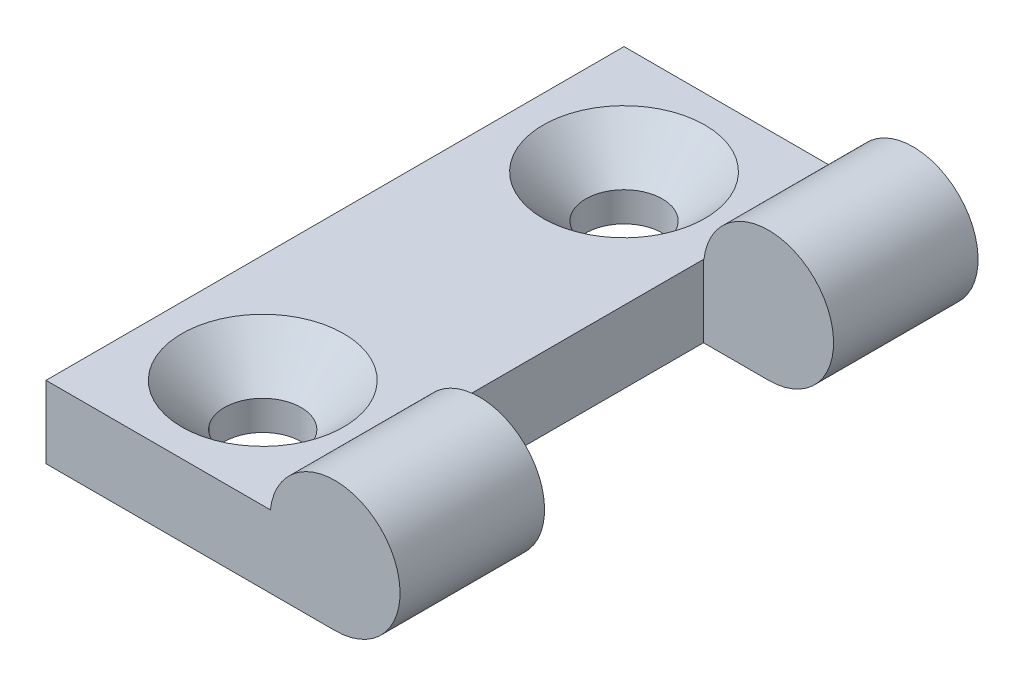
ISO-10303-21;
HEADER;
FILE_DESCRIPTION(('STEP AP214'),'2;1');
FILE_NAME('part.step','',(''),(''),'','','');
FILE_SCHEMA(('AUTOMOTIVE_DESIGN { 1 0 10303 214 1 1 1 1 }'));
ENDSEC;
DATA;
#1=APPLICATION_CONTEXT('core data for automotive mechanical design processes');
#2=APPLICATION_PROTOCOL_DEFINITION('international standard','automotive_design',2000,#1);
#3=PRODUCT_CONTEXT('',#1,'mechanical');
#4=PRODUCT('Part','Part','',(#3));
#5=PRODUCT_RELATED_PRODUCT_CATEGORY('part','',(#4));
#6=PRODUCT_DEFINITION_FORMATION('','',#4);
#7=PRODUCT_DEFINITION_CONTEXT('part definition',#1,'design');
#8=PRODUCT_DEFINITION('design','',#6,#7);
#9=PRODUCT_DEFINITION_SHAPE('','',#8);
#10=(LENGTH_UNIT() NAMED_UNIT(*) SI_UNIT(.MILLI.,.METRE.));
#11=(NAMED_UNIT(*) PLANE_ANGLE_UNIT() SI_UNIT($,.RADIAN.));
#12=(NAMED_UNIT(*) SI_UNIT($,.STERADIAN.) SOLID_ANGLE_UNIT());
#13=UNCERTAINTY_MEASURE_WITH_UNIT(LENGTH_MEASURE(1.E-05),#10,'distance_accuracy_value','');
#14=(GEOMETRIC_REPRESENTATION_CONTEXT(3) GLOBAL_UNCERTAINTY_ASSIGNED_CONTEXT((#13)) GLOBAL_UNIT_ASSIGNED_CONTEXT((#10,
#11,#12)) REPRESENTATION_CONTEXT('',''));
#15=CARTESIAN_POINT('',(0.,0.,0.));
#16=DIRECTION('',(0.,0.,1.));
#17=DIRECTION('',(1.,0.,0.));
#18=AXIS2_PLACEMENT_3D('',#15,#16,#17);
#19=CARTESIAN_POINT('',(-2.5,4.99999999993861,12.5));
#20=DIRECTION('',(0.,1.,0.));
#21=DIRECTION('',(0.,0.,1.));
#22=AXIS2_PLACEMENT_3D('',#19,#20,#21);
#23=CONICAL_SURFACE('',#22,5.59999999989031,0.785398163397448);
#24=CARTESIAN_POINT('',(-2.5,2.04999999999999,12.5));
#25=DIRECTION('',(0.,1.,0.));
#26=DIRECTION('',(0.,0.,1.));
#27=AXIS2_PLACEMENT_3D('',#24,#25,#26);
#28=CIRCLE('',#27,2.64999999999999);
#29=CARTESIAN_POINT('',(-2.5,2.04999999999999,15.15));
#30=VERTEX_POINT('',#29);
#31=EDGE_CURVE('E132',#30,#30,#28,.F.);
#32=ORIENTED_EDGE('',*,*,#31,.T.);
#33=EDGE_LOOP('',(#32));
#34=FACE_BOUND('',#33,.T.);
#35=CARTESIAN_POINT('',(-2.5,4.99999999999545,12.5));
#36=DIRECTION('',(0.,1.,0.));
#37=DIRECTION('',(0.,0.,1.));
#38=AXIS2_PLACEMENT_3D('',#35,#36,#37);
#39=CIRCLE('',#38,5.59999999994716);
#40=CARTESIAN_POINT('',(-2.5,4.99999999999545,18.0999999999472));
#41=VERTEX_POINT('',#40);
#42=EDGE_CURVE('E20',#41,#41,#39,.F.);
#43=ORIENTED_EDGE('',*,*,#42,.F.);
#44=EDGE_LOOP('',(#43));
#45=FACE_BOUND('',#44,.T.);
#46=ADVANCED_FACE('F17',(#34,#45),#23,.F.);
#47=CARTESIAN_POINT('',(-2.5,4.99999999988177,-12.5));
#48=DIRECTION('',(0.,1.,0.));
#49=DIRECTION('',(0.,0.,1.));
#50=AXIS2_PLACEMENT_3D('',#47,#48,#49);
#51=CONICAL_SURFACE('',#50,5.5999999999699,0.785398163407083);
#52=CARTESIAN_POINT('',(-2.5,2.04999999999999,-12.5));
#53=DIRECTION('',(0.,1.,0.));
#54=DIRECTION('',(0.,0.,1.));
#55=AXIS2_PLACEMENT_3D('',#52,#53,#54);
#56=CIRCLE('',#55,2.64999999999999);
#57=CARTESIAN_POINT('',(-2.5,2.04999999999999,-9.85000000000001));
#58=VERTEX_POINT('',#57);
#59=EDGE_CURVE('E120',#58,#58,#56,.F.);
#60=ORIENTED_EDGE('',*,*,#59,.T.);
#61=EDGE_LOOP('',(#60));
#62=FACE_BOUND('',#61,.T.);
#63=CARTESIAN_POINT('',(-2.5,4.99999999992724,-12.5));
#64=DIRECTION('',(0.,1.,0.));
#65=DIRECTION('',(0.,0.,1.));
#66=AXIS2_PLACEMENT_3D('',#63,#64,#65);
#67=CIRCLE('',#66,5.60000000001537);
#68=CARTESIAN_POINT('',(-2.5,4.99999999992724,-6.89999999998463));
#69=VERTEX_POINT('',#68);
#70=EDGE_CURVE('E137',#69,#69,#67,.F.);
#71=ORIENTED_EDGE('',*,*,#70,.F.);
#72=EDGE_LOOP('',(#71));
#73=FACE_BOUND('',#72,.T.);
#74=ADVANCED_FACE('F170',(#62,#73),#51,.F.);
#75=CARTESIAN_POINT('',(0.,5.,0.));
#76=DIRECTION('',(0.,1.,0.));
#77=DIRECTION('',(0.,0.,1.));
#78=AXIS2_PLACEMENT_3D('',#75,#76,#77);
#79=PLANE('',#78);
#80=DIRECTION('',(1.,0.,0.));
#81=VECTOR('',#80,1.);
#82=CARTESIAN_POINT('',(5.50000000000001,5.,10.));
#83=LINE('',#82,#81);
#84=CARTESIAN_POINT('',(5.52786404500043,5.,10.));
#85=VERTEX_POINT('',#84);
#86=CARTESIAN_POINT('',(5.50000000000001,5.,10.));
#87=VERTEX_POINT('',#86);
#88=EDGE_CURVE('E160',#85,#87,#83,.F.);
#89=ORIENTED_EDGE('',*,*,#88,.T.);
#90=DIRECTION('',(0.,0.,1.));
#91=VECTOR('',#90,1.);
#92=CARTESIAN_POINT('',(5.50000000000001,5.,-10.));
#93=LINE('',#92,#91);
#94=CARTESIAN_POINT('',(5.50000000000001,5.,-10.));
#95=VERTEX_POINT('',#94);
#96=EDGE_CURVE('E123',#87,#95,#93,.F.);
#97=ORIENTED_EDGE('',*,*,#96,.T.);
#98=DIRECTION('',(1.,0.,0.));
#99=VECTOR('',#98,1.);
#100=CARTESIAN_POINT('',(0.,5.,-10.));
#101=LINE('',#100,#99);
#102=CARTESIAN_POINT('',(5.52786404500043,5.,-10.));
#103=VERTEX_POINT('',#102);
#104=EDGE_CURVE('E134',#95,#103,#101,.T.);
#105=ORIENTED_EDGE('',*,*,#104,.T.);
#106=DIRECTION('',(0.,0.,1.));
#107=VECTOR('',#106,1.);
#108=CARTESIAN_POINT('',(5.52786404500043,5.,-20.));
#109=LINE('',#108,#107);
#110=CARTESIAN_POINT('',(5.52786404500043,5.,-20.));
#111=VERTEX_POINT('',#110);
#112=EDGE_CURVE('E130',#111,#103,#109,.T.);
#113=ORIENTED_EDGE('',*,*,#112,.F.);
#114=DIRECTION('',(1.,0.,0.));
#115=VECTOR('',#114,1.);
#116=CARTESIAN_POINT('',(-10.,5.,-20.));
#117=LINE('',#116,#115);
#118=CARTESIAN_POINT('',(-10.,5.,-20.));
#119=VERTEX_POINT('',#118);
#120=EDGE_CURVE('E114',#111,#119,#117,.F.);
#121=ORIENTED_EDGE('',*,*,#120,.T.);
#122=DIRECTION('',(0.,0.,-1.));
#123=VECTOR('',#122,1.);
#124=CARTESIAN_POINT('',(-10.,5.,-20.));
#125=LINE('',#124,#123);
#126=CARTESIAN_POINT('',(-9.99999999999999,5.,20.));
#127=VERTEX_POINT('',#126);
#128=EDGE_CURVE('E74',#119,#127,#125,.F.);
#129=ORIENTED_EDGE('',*,*,#128,.T.);
#130=DIRECTION('',(-1.,0.,0.));
#131=VECTOR('',#130,1.);
#132=CARTESIAN_POINT('',(-9.99999999999999,5.,20.));
#133=LINE('',#132,#131);
#134=CARTESIAN_POINT('',(5.52786404500043,5.,20.));
#135=VERTEX_POINT('',#134);
#136=EDGE_CURVE('E90',#127,#135,#133,.F.);
#137=ORIENTED_EDGE('',*,*,#136,.T.);
#138=DIRECTION('',(0.,0.,1.));
#139=VECTOR('',#138,1.);
#140=CARTESIAN_POINT('',(5.52786404500043,5.,0.));
#141=LINE('',#140,#139);
#142=EDGE_CURVE('E133',#135,#85,#141,.F.);
#143=ORIENTED_EDGE('',*,*,#142,.T.);
#144=EDGE_LOOP('',(#89,#97,#105,#113,#121,#129,#137,#143));
#145=FACE_BOUND('',#144,.T.);
#146=ORIENTED_EDGE('',*,*,#70,.T.);
#147=EDGE_LOOP('',(#146));
#148=FACE_BOUND('',#147,.T.);
#149=ORIENTED_EDGE('',*,*,#42,.T.);
#150=EDGE_LOOP('',(#149));
#151=FACE_BOUND('',#150,.T.);
#152=ADVANCED_FACE('F167',(#145,#148,#151),#79,.T.);
#153=CARTESIAN_POINT('',(-2.5,5.,12.5));
#154=DIRECTION('',(0.,1.,0.));
#155=DIRECTION('',(0.,0.,1.));
#156=AXIS2_PLACEMENT_3D('',#153,#154,#155);
#157=CYLINDRICAL_SURFACE('',#156,2.64999999999999);
#158=CARTESIAN_POINT('',(-2.5,0.,12.5));
#159=DIRECTION('',(0.,1.,0.));
#160=DIRECTION('',(0.,0.,1.));
#161=AXIS2_PLACEMENT_3D('',#158,#159,#160);
#162=CIRCLE('',#161,2.64999999999999);
#163=CARTESIAN_POINT('',(-2.5,0.,15.15));
#164=VERTEX_POINT('',#163);
#165=EDGE_CURVE('E150',#164,#164,#162,.F.);
#166=ORIENTED_EDGE('',*,*,#165,.T.);
#167=EDGE_LOOP('',(#166));
#168=FACE_BOUND('',#167,.T.);
#169=ORIENTED_EDGE('',*,*,#31,.F.);
#170=EDGE_LOOP('',(#169));
#171=FACE_BOUND('',#170,.T.);
#172=ADVANCED_FACE('F212',(#168,#171),#157,.F.);
#173=CARTESIAN_POINT('',(-2.5,5.,-12.5));
#174=DIRECTION('',(0.,1.,0.));
#175=DIRECTION('',(0.,0.,1.));
#176=AXIS2_PLACEMENT_3D('',#173,#174,#175);
#177=CYLINDRICAL_SURFACE('',#176,2.64999999999999);
#178=CARTESIAN_POINT('',(-2.5,0.,-12.5));
#179=DIRECTION('',(0.,1.,0.));
#180=DIRECTION('',(0.,0.,1.));
#181=AXIS2_PLACEMENT_3D('',#178,#179,#180);
#182=CIRCLE('',#181,2.64999999999999);
#183=CARTESIAN_POINT('',(-2.5,0.,-9.85000000000001));
#184=VERTEX_POINT('',#183);
#185=EDGE_CURVE('E106',#184,#184,#182,.F.);
#186=ORIENTED_EDGE('',*,*,#185,.T.);
#187=EDGE_LOOP('',(#186));
#188=FACE_BOUND('',#187,.T.);
#189=ORIENTED_EDGE('',*,*,#59,.F.);
#190=EDGE_LOOP('',(#189));
#191=FACE_BOUND('',#190,.T.);
#192=ADVANCED_FACE('F208',(#188,#191),#177,.F.);
#193=CARTESIAN_POINT('',(-10.,5.,-20.));
#194=DIRECTION('',(0.,0.,1.));
#195=DIRECTION('',(1.,0.,0.));
#196=AXIS2_PLACEMENT_3D('',#193,#194,#195);
#197=PLANE('',#196);
#198=DIRECTION('',(1.,0.,0.));
#199=VECTOR('',#198,1.);
#200=CARTESIAN_POINT('',(0.,0.,-20.));
#201=LINE('',#200,#199);
#202=CARTESIAN_POINT('',(10.,0.,-20.));
#203=VERTEX_POINT('',#202);
#204=CARTESIAN_POINT('',(-10.,0.,-20.));
#205=VERTEX_POINT('',#204);
#206=EDGE_CURVE('E104',#203,#205,#201,.F.);
#207=ORIENTED_EDGE('',*,*,#206,.T.);
#208=DIRECTION('',(0.,1.,0.));
#209=VECTOR('',#208,1.);
#210=CARTESIAN_POINT('',(-10.,5.,-20.));
#211=LINE('',#210,#209);
#212=EDGE_CURVE('E82',#205,#119,#211,.T.);
#213=ORIENTED_EDGE('',*,*,#212,.T.);
#214=ORIENTED_EDGE('',*,*,#120,.F.);
#215=CARTESIAN_POINT('',(10.,4.5,-20.));
#216=DIRECTION('',(0.,0.,1.));
#217=DIRECTION('',(1.,0.,0.));
#218=AXIS2_PLACEMENT_3D('',#215,#216,#217);
#219=CIRCLE('',#218,4.5);
#220=EDGE_CURVE('E154',#203,#111,#219,.T.);
#221=ORIENTED_EDGE('',*,*,#220,.F.);
#222=EDGE_LOOP('',(#207,#213,#214,#221));
#223=FACE_BOUND('',#222,.T.);
#224=ADVANCED_FACE('F205',(#223),#197,.F.);
#225=CARTESIAN_POINT('',(-10.,5.,-20.));
#226=DIRECTION('',(1.,0.,0.));
#227=DIRECTION('',(0.,0.,-1.));
#228=AXIS2_PLACEMENT_3D('',#225,#226,#227);
#229=PLANE('',#228);
#230=DIRECTION('',(0.,1.,0.));
#231=VECTOR('',#230,1.);
#232=CARTESIAN_POINT('',(-9.99999999999999,5.,20.));
#233=LINE('',#232,#231);
#234=CARTESIAN_POINT('',(-10.,0.,20.));
#235=VERTEX_POINT('',#234);
#236=EDGE_CURVE('E86',#235,#127,#233,.T.);
#237=ORIENTED_EDGE('',*,*,#236,.T.);
#238=ORIENTED_EDGE('',*,*,#128,.F.);
#239=ORIENTED_EDGE('',*,*,#212,.F.);
#240=DIRECTION('',(0.,0.,1.));
#241=VECTOR('',#240,1.);
#242=CARTESIAN_POINT('',(-10.,0.,0.));
#243=LINE('',#242,#241);
#244=EDGE_CURVE('E97',#205,#235,#243,.T.);
#245=ORIENTED_EDGE('',*,*,#244,.T.);
#246=EDGE_LOOP('',(#237,#238,#239,#245));
#247=FACE_BOUND('',#246,.T.);
#248=ADVANCED_FACE('F103',(#247),#229,.F.);
#249=CARTESIAN_POINT('',(-9.99999999999999,5.,20.));
#250=DIRECTION('',(0.,0.,-1.));
#251=DIRECTION('',(-1.,0.,0.));
#252=AXIS2_PLACEMENT_3D('',#249,#250,#251);
#253=PLANE('',#252);
#254=CARTESIAN_POINT('',(10.,4.5,20.));
#255=DIRECTION('',(0.,0.,1.));
#256=DIRECTION('',(1.,0.,0.));
#257=AXIS2_PLACEMENT_3D('',#254,#255,#256);
#258=CIRCLE('',#257,4.5);
#259=CARTESIAN_POINT('',(10.,0.,20.));
#260=VERTEX_POINT('',#259);
#261=EDGE_CURVE('E65',#135,#260,#258,.F.);
#262=ORIENTED_EDGE('',*,*,#261,.F.);
#263=ORIENTED_EDGE('',*,*,#136,.F.);
#264=ORIENTED_EDGE('',*,*,#236,.F.);
#265=DIRECTION('',(1.,0.,0.));
#266=VECTOR('',#265,1.);
#267=CARTESIAN_POINT('',(0.,0.,20.));
#268=LINE('',#267,#266);
#269=EDGE_CURVE('E89',#235,#260,#268,.T.);
#270=ORIENTED_EDGE('',*,*,#269,.T.);
#271=EDGE_LOOP('',(#262,#263,#264,#270));
#272=FACE_BOUND('',#271,.T.);
#273=ADVANCED_FACE('F88',(#272),#253,.F.);
#274=CARTESIAN_POINT('',(10.,4.5,-20.));
#275=DIRECTION('',(0.,0.,1.));
#276=DIRECTION('',(1.,0.,0.));
#277=AXIS2_PLACEMENT_3D('',#274,#275,#276);
#278=CYLINDRICAL_SURFACE('',#277,4.5);
#279=ORIENTED_EDGE('',*,*,#261,.T.);
#280=DIRECTION('',(0.,0.,1.));
#281=VECTOR('',#280,1.);
#282=CARTESIAN_POINT('',(10.,0.,0.));
#283=LINE('',#282,#281);
#284=CARTESIAN_POINT('',(10.,0.,10.));
#285=VERTEX_POINT('',#284);
#286=EDGE_CURVE('E101',#260,#285,#283,.F.);
#287=ORIENTED_EDGE('',*,*,#286,.T.);
#288=CARTESIAN_POINT('',(10.,4.5,10.));
#289=DIRECTION('',(0.,0.,1.));
#290=DIRECTION('',(1.,0.,0.));
#291=AXIS2_PLACEMENT_3D('',#288,#289,#290);
#292=CIRCLE('',#291,4.5);
#293=EDGE_CURVE('E157',#285,#85,#292,.T.);
#294=ORIENTED_EDGE('',*,*,#293,.T.);
#295=ORIENTED_EDGE('',*,*,#142,.F.);
#296=EDGE_LOOP('',(#279,#287,#294,#295));
#297=FACE_BOUND('',#296,.T.);
#298=ADVANCED_FACE('F196',(#297),#278,.T.);
#299=CARTESIAN_POINT('',(5.50000000000001,9.,10.));
#300=DIRECTION('',(0.,0.,1.));
#301=DIRECTION('',(1.,0.,0.));
#302=AXIS2_PLACEMENT_3D('',#299,#300,#301);
#303=PLANE('',#302);
#304=ORIENTED_EDGE('',*,*,#293,.F.);
#305=DIRECTION('',(1.,0.,0.));
#306=VECTOR('',#305,1.);
#307=CARTESIAN_POINT('',(0.,0.,10.));
#308=LINE('',#307,#306);
#309=CARTESIAN_POINT('',(5.50000000000001,0.,10.));
#310=VERTEX_POINT('',#309);
#311=EDGE_CURVE('E230',#285,#310,#308,.F.);
#312=ORIENTED_EDGE('',*,*,#311,.T.);
#313=DIRECTION('',(0.,1.,0.));
#314=VECTOR('',#313,1.);
#315=CARTESIAN_POINT('',(5.50000000000001,9.,10.));
#316=LINE('',#315,#314);
#317=EDGE_CURVE('E127',#310,#87,#316,.T.);
#318=ORIENTED_EDGE('',*,*,#317,.T.);
#319=ORIENTED_EDGE('',*,*,#88,.F.);
#320=EDGE_LOOP('',(#304,#312,#318,#319));
#321=FACE_BOUND('',#320,.T.);
#322=ADVANCED_FACE('F192',(#321),#303,.F.);
#323=CARTESIAN_POINT('',(5.50000000000001,9.,-10.));
#324=DIRECTION('',(-1.,0.,0.));
#325=DIRECTION('',(0.,0.,1.));
#326=AXIS2_PLACEMENT_3D('',#323,#324,#325);
#327=PLANE('',#326);
#328=ORIENTED_EDGE('',*,*,#317,.F.);
#329=DIRECTION('',(0.,0.,1.));
#330=VECTOR('',#329,1.);
#331=CARTESIAN_POINT('',(5.50000000000001,0.,0.));
#332=LINE('',#331,#330);
#333=CARTESIAN_POINT('',(5.50000000000001,0.,-10.));
#334=VERTEX_POINT('',#333);
#335=EDGE_CURVE('E239',#310,#334,#332,.F.);
#336=ORIENTED_EDGE('',*,*,#335,.T.);
#337=DIRECTION('',(0.,1.,0.));
#338=VECTOR('',#337,1.);
#339=CARTESIAN_POINT('',(5.50000000000001,9.,-10.));
#340=LINE('',#339,#338);
#341=EDGE_CURVE('E126',#334,#95,#340,.T.);
#342=ORIENTED_EDGE('',*,*,#341,.T.);
#343=ORIENTED_EDGE('',*,*,#96,.F.);
#344=EDGE_LOOP('',(#328,#336,#342,#343));
#345=FACE_BOUND('',#344,.T.);
#346=ADVANCED_FACE('F188',(#345),#327,.F.);
#347=CARTESIAN_POINT('',(5.50000000000001,9.,-10.));
#348=DIRECTION('',(0.,0.,-1.));
#349=DIRECTION('',(-1.,0.,0.));
#350=AXIS2_PLACEMENT_3D('',#347,#348,#349);
#351=PLANE('',#350);
#352=ORIENTED_EDGE('',*,*,#341,.F.);
#353=DIRECTION('',(1.,0.,0.));
#354=VECTOR('',#353,1.);
#355=CARTESIAN_POINT('',(0.,0.,-10.));
#356=LINE('',#355,#354);
#357=CARTESIAN_POINT('',(10.,0.,-10.));
#358=VERTEX_POINT('',#357);
#359=EDGE_CURVE('E26',#334,#358,#356,.T.);
#360=ORIENTED_EDGE('',*,*,#359,.T.);
#361=CARTESIAN_POINT('',(10.,4.5,-10.));
#362=DIRECTION('',(0.,0.,1.));
#363=DIRECTION('',(1.,0.,0.));
#364=AXIS2_PLACEMENT_3D('',#361,#362,#363);
#365=CIRCLE('',#364,4.5);
#366=EDGE_CURVE('E34',#103,#358,#365,.F.);
#367=ORIENTED_EDGE('',*,*,#366,.F.);
#368=ORIENTED_EDGE('',*,*,#104,.F.);
#369=EDGE_LOOP('',(#352,#360,#367,#368));
#370=FACE_BOUND('',#369,.T.);
#371=ADVANCED_FACE('F183',(#370),#351,.F.);
#372=CARTESIAN_POINT('',(10.,4.5,-20.));
#373=DIRECTION('',(0.,0.,1.));
#374=DIRECTION('',(1.,0.,0.));
#375=AXIS2_PLACEMENT_3D('',#372,#373,#374);
#376=CYLINDRICAL_SURFACE('',#375,4.5);
#377=ORIENTED_EDGE('',*,*,#366,.T.);
#378=DIRECTION('',(0.,0.,1.));
#379=VECTOR('',#378,1.);
#380=CARTESIAN_POINT('',(10.,0.,0.));
#381=LINE('',#380,#379);
#382=EDGE_CURVE('E11',#358,#203,#381,.F.);
#383=ORIENTED_EDGE('',*,*,#382,.T.);
#384=ORIENTED_EDGE('',*,*,#220,.T.);
#385=ORIENTED_EDGE('',*,*,#112,.T.);
#386=EDGE_LOOP('',(#377,#383,#384,#385));
#387=FACE_BOUND('',#386,.T.);
#388=ADVANCED_FACE('F178',(#387),#376,.T.);
#389=CARTESIAN_POINT('',(0.,0.,0.));
#390=DIRECTION('',(0.,1.,0.));
#391=DIRECTION('',(0.,0.,1.));
#392=AXIS2_PLACEMENT_3D('',#389,#390,#391);
#393=PLANE('',#392);
#394=ORIENTED_EDGE('',*,*,#359,.F.);
#395=ORIENTED_EDGE('',*,*,#335,.F.);
#396=ORIENTED_EDGE('',*,*,#311,.F.);
#397=ORIENTED_EDGE('',*,*,#286,.F.);
#398=ORIENTED_EDGE('',*,*,#269,.F.);
#399=ORIENTED_EDGE('',*,*,#244,.F.);
#400=ORIENTED_EDGE('',*,*,#206,.F.);
#401=ORIENTED_EDGE('',*,*,#382,.F.);
#402=EDGE_LOOP('',(#394,#395,#396,#397,#398,#399,#400,#401));
#403=FACE_BOUND('',#402,.T.);
#404=ORIENTED_EDGE('',*,*,#185,.F.);
#405=EDGE_LOOP('',(#404));
#406=FACE_BOUND('',#405,.T.);
#407=ORIENTED_EDGE('',*,*,#165,.F.);
#408=EDGE_LOOP('',(#407));
#409=FACE_BOUND('',#408,.T.);
#410=ADVANCED_FACE('F95',(#403,#406,#409),#393,.F.);
#411=CLOSED_SHELL('',(#46,#74,#152,#172,#192,#224,#248,#273,#298,#322,#346,#371,#388,#410));
#412=MANIFOLD_SOLID_BREP('B1',#411);
#413=ADVANCED_BREP_SHAPE_REPRESENTATION('',(#18,#412),#14);
#414=SHAPE_DEFINITION_REPRESENTATION(#9,#413);
ENDSEC;
END-ISO-10303-21;
